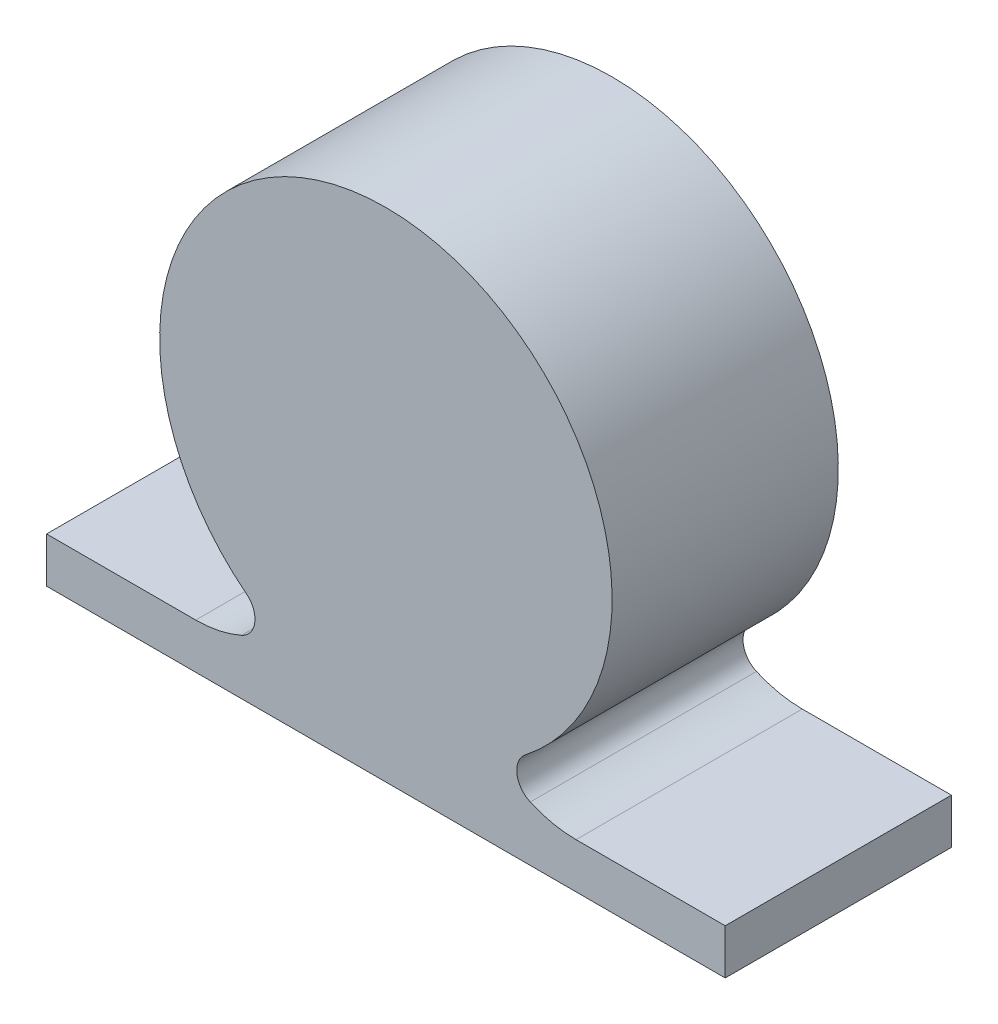
ISO-10303-21;
HEADER;
FILE_DESCRIPTION(('STEP AP214'),'2;1');
FILE_NAME('part.step','',(''),(''),'','','');
FILE_SCHEMA(('AUTOMOTIVE_DESIGN { 1 0 10303 214 1 1 1 1 }'));
ENDSEC;
DATA;
#1=APPLICATION_CONTEXT('core data for automotive mechanical design processes');
#2=APPLICATION_PROTOCOL_DEFINITION('international standard','automotive_design',2000,#1);
#3=PRODUCT_CONTEXT('',#1,'mechanical');
#4=PRODUCT('Part','Part','',(#3));
#5=PRODUCT_RELATED_PRODUCT_CATEGORY('part','',(#4));
#6=PRODUCT_DEFINITION_FORMATION('','',#4);
#7=PRODUCT_DEFINITION_CONTEXT('part definition',#1,'design');
#8=PRODUCT_DEFINITION('design','',#6,#7);
#9=PRODUCT_DEFINITION_SHAPE('','',#8);
#10=(LENGTH_UNIT() NAMED_UNIT(*) SI_UNIT(.MILLI.,.METRE.));
#11=(NAMED_UNIT(*) PLANE_ANGLE_UNIT() SI_UNIT($,.RADIAN.));
#12=(NAMED_UNIT(*) SI_UNIT($,.STERADIAN.) SOLID_ANGLE_UNIT());
#13=UNCERTAINTY_MEASURE_WITH_UNIT(LENGTH_MEASURE(1.E-05),#10,'distance_accuracy_value','');
#14=(GEOMETRIC_REPRESENTATION_CONTEXT(3) GLOBAL_UNCERTAINTY_ASSIGNED_CONTEXT((#13)) GLOBAL_UNIT_ASSIGNED_CONTEXT((#10,
#11,#12)) REPRESENTATION_CONTEXT('',''));
#15=CARTESIAN_POINT('',(0.,0.,0.));
#16=DIRECTION('',(0.,0.,1.));
#17=DIRECTION('',(1.,0.,0.));
#18=AXIS2_PLACEMENT_3D('',#15,#16,#17);
#19=CARTESIAN_POINT('',(0.,0.,5.08));
#20=DIRECTION('',(0.,0.,-1.));
#21=DIRECTION('',(-1.,0.,0.));
#22=AXIS2_PLACEMENT_3D('',#19,#20,#21);
#23=CYLINDRICAL_SURFACE('',#22,5.08);
#24=CARTESIAN_POINT('',(0.,0.,0.));
#25=DIRECTION('',(0.,0.,1.));
#26=DIRECTION('',(1.,0.,0.));
#27=AXIS2_PLACEMENT_3D('',#24,#25,#26);
#28=CIRCLE('',#27,5.08);
#29=CARTESIAN_POINT('',(3.1339820043525,-3.99806913351866,0.));
#30=VERTEX_POINT('',#29);
#31=CARTESIAN_POINT('',(-3.1339820043525,-3.99806913351867,0.));
#32=VERTEX_POINT('',#31);
#33=EDGE_CURVE('E149',#30,#32,#28,.T.);
#34=ORIENTED_EDGE('',*,*,#33,.T.);
#35=DIRECTION('',(0.,0.,-1.));
#36=VECTOR('',#35,1.);
#37=CARTESIAN_POINT('',(-3.1339820043525,-3.99806913351867,5.08));
#38=LINE('',#37,#36);
#39=CARTESIAN_POINT('',(-3.1339820043525,-3.99806913351867,5.08));
#40=VERTEX_POINT('',#39);
#41=EDGE_CURVE('E185',#32,#40,#38,.F.);
#42=ORIENTED_EDGE('',*,*,#41,.T.);
#43=CARTESIAN_POINT('',(0.,0.,5.08));
#44=DIRECTION('',(0.,0.,1.));
#45=DIRECTION('',(1.,0.,0.));
#46=AXIS2_PLACEMENT_3D('',#43,#44,#45);
#47=CIRCLE('',#46,5.08);
#48=CARTESIAN_POINT('',(3.1339820043525,-3.99806913351866,5.08));
#49=VERTEX_POINT('',#48);
#50=EDGE_CURVE('E123',#49,#40,#47,.T.);
#51=ORIENTED_EDGE('',*,*,#50,.F.);
#52=DIRECTION('',(0.,0.,-1.));
#53=VECTOR('',#52,1.);
#54=CARTESIAN_POINT('',(3.1339820043525,-3.99806913351866,5.08));
#55=LINE('',#54,#53);
#56=EDGE_CURVE('E182',#49,#30,#55,.T.);
#57=ORIENTED_EDGE('',*,*,#56,.T.);
#58=EDGE_LOOP('',(#34,#42,#51,#57));
#59=FACE_BOUND('',#58,.T.);
#60=ADVANCED_FACE('F36',(#59),#23,.T.);
#61=CARTESIAN_POINT('',(0.,-5.08,5.08));
#62=DIRECTION('',(0.,-1.,0.));
#63=DIRECTION('',(1.,0.,0.));
#64=AXIS2_PLACEMENT_3D('',#61,#62,#63);
#65=PLANE('',#64);
#66=DIRECTION('',(-1.,0.,0.));
#67=VECTOR('',#66,1.);
#68=CARTESIAN_POINT('',(0.,-5.08,5.08));
#69=LINE('',#68,#67);
#70=CARTESIAN_POINT('',(-4.27037509812836,-5.08,5.08));
#71=VERTEX_POINT('',#70);
#72=CARTESIAN_POINT('',(-7.62,-5.08,5.08));
#73=VERTEX_POINT('',#72);
#74=EDGE_CURVE('E111',#71,#73,#69,.T.);
#75=ORIENTED_EDGE('',*,*,#74,.F.);
#76=DIRECTION('',(0.,0.,-1.));
#77=VECTOR('',#76,1.);
#78=CARTESIAN_POINT('',(-4.27037509812836,-5.08,5.08));
#79=LINE('',#78,#77);
#80=CARTESIAN_POINT('',(-4.27037509812836,-5.08,0.));
#81=VERTEX_POINT('',#80);
#82=EDGE_CURVE('E133',#71,#81,#79,.T.);
#83=ORIENTED_EDGE('',*,*,#82,.T.);
#84=DIRECTION('',(-1.,0.,0.));
#85=VECTOR('',#84,1.);
#86=CARTESIAN_POINT('',(0.,-5.08,0.));
#87=LINE('',#86,#85);
#88=CARTESIAN_POINT('',(-7.62,-5.08,0.));
#89=VERTEX_POINT('',#88);
#90=EDGE_CURVE('E129',#81,#89,#87,.T.);
#91=ORIENTED_EDGE('',*,*,#90,.T.);
#92=DIRECTION('',(0.,0.,-1.));
#93=VECTOR('',#92,1.);
#94=CARTESIAN_POINT('',(-7.62,-5.08,5.08));
#95=LINE('',#94,#93);
#96=EDGE_CURVE('E126',#73,#89,#95,.T.);
#97=ORIENTED_EDGE('',*,*,#96,.F.);
#98=EDGE_LOOP('',(#75,#83,#91,#97));
#99=FACE_BOUND('',#98,.T.);
#100=ADVANCED_FACE('F127',(#99),#65,.F.);
#101=CARTESIAN_POINT('',(-7.62000000000002,0.,5.08));
#102=DIRECTION('',(1.,0.,0.));
#103=DIRECTION('',(0.,1.,0.));
#104=AXIS2_PLACEMENT_3D('',#101,#102,#103);
#105=PLANE('',#104);
#106=DIRECTION('',(0.,-1.,0.));
#107=VECTOR('',#106,1.);
#108=CARTESIAN_POINT('',(-7.62000000000002,0.,0.));
#109=LINE('',#108,#107);
#110=CARTESIAN_POINT('',(-7.62,-6.096,0.));
#111=VERTEX_POINT('',#110);
#112=EDGE_CURVE('E153',#89,#111,#109,.T.);
#113=ORIENTED_EDGE('',*,*,#112,.T.);
#114=DIRECTION('',(0.,0.,-1.));
#115=VECTOR('',#114,1.);
#116=CARTESIAN_POINT('',(-7.62,-6.096,5.08));
#117=LINE('',#116,#115);
#118=CARTESIAN_POINT('',(-7.62,-6.096,5.08));
#119=VERTEX_POINT('',#118);
#120=EDGE_CURVE('E134',#119,#111,#117,.T.);
#121=ORIENTED_EDGE('',*,*,#120,.F.);
#122=DIRECTION('',(0.,-1.,0.));
#123=VECTOR('',#122,1.);
#124=CARTESIAN_POINT('',(-7.62000000000002,0.,5.08));
#125=LINE('',#124,#123);
#126=EDGE_CURVE('E116',#73,#119,#125,.T.);
#127=ORIENTED_EDGE('',*,*,#126,.F.);
#128=ORIENTED_EDGE('',*,*,#96,.T.);
#129=EDGE_LOOP('',(#113,#121,#127,#128));
#130=FACE_BOUND('',#129,.T.);
#131=ADVANCED_FACE('F136',(#130),#105,.F.);
#132=CARTESIAN_POINT('',(0.,-6.096,5.08));
#133=DIRECTION('',(0.,-1.,0.));
#134=DIRECTION('',(0.,0.,-1.));
#135=AXIS2_PLACEMENT_3D('',#132,#133,#134);
#136=PLANE('',#135);
#137=DIRECTION('',(-1.,0.,0.));
#138=VECTOR('',#137,1.);
#139=CARTESIAN_POINT('',(0.,-6.096,0.));
#140=LINE('',#139,#138);
#141=CARTESIAN_POINT('',(7.62,-6.096,0.));
#142=VERTEX_POINT('',#141);
#143=EDGE_CURVE('E155',#142,#111,#140,.T.);
#144=ORIENTED_EDGE('',*,*,#143,.F.);
#145=DIRECTION('',(0.,0.,-1.));
#146=VECTOR('',#145,1.);
#147=CARTESIAN_POINT('',(7.62,-6.096,5.08));
#148=LINE('',#147,#146);
#149=CARTESIAN_POINT('',(7.62,-6.096,5.08));
#150=VERTEX_POINT('',#149);
#151=EDGE_CURVE('E165',#150,#142,#148,.T.);
#152=ORIENTED_EDGE('',*,*,#151,.F.);
#153=DIRECTION('',(-1.,0.,0.));
#154=VECTOR('',#153,1.);
#155=CARTESIAN_POINT('',(0.,-6.096,5.08));
#156=LINE('',#155,#154);
#157=EDGE_CURVE('E138',#150,#119,#156,.T.);
#158=ORIENTED_EDGE('',*,*,#157,.T.);
#159=ORIENTED_EDGE('',*,*,#120,.T.);
#160=EDGE_LOOP('',(#144,#152,#158,#159));
#161=FACE_BOUND('',#160,.T.);
#162=ADVANCED_FACE('F218',(#161),#136,.T.);
#163=CARTESIAN_POINT('',(7.61999999999999,0.,5.08));
#164=DIRECTION('',(1.,0.,0.));
#165=DIRECTION('',(0.,1.,0.));
#166=AXIS2_PLACEMENT_3D('',#163,#164,#165);
#167=PLANE('',#166);
#168=DIRECTION('',(0.,-1.,0.));
#169=VECTOR('',#168,1.);
#170=CARTESIAN_POINT('',(7.61999999999999,0.,0.));
#171=LINE('',#170,#169);
#172=CARTESIAN_POINT('',(7.62,-5.08,0.));
#173=VERTEX_POINT('',#172);
#174=EDGE_CURVE('E158',#173,#142,#171,.T.);
#175=ORIENTED_EDGE('',*,*,#174,.F.);
#176=DIRECTION('',(0.,0.,-1.));
#177=VECTOR('',#176,1.);
#178=CARTESIAN_POINT('',(7.62,-5.08,5.08));
#179=LINE('',#178,#177);
#180=CARTESIAN_POINT('',(7.62,-5.08,5.08));
#181=VERTEX_POINT('',#180);
#182=EDGE_CURVE('E148',#181,#173,#179,.T.);
#183=ORIENTED_EDGE('',*,*,#182,.F.);
#184=DIRECTION('',(0.,-1.,0.));
#185=VECTOR('',#184,1.);
#186=CARTESIAN_POINT('',(7.61999999999999,0.,5.08));
#187=LINE('',#186,#185);
#188=EDGE_CURVE('E140',#181,#150,#187,.T.);
#189=ORIENTED_EDGE('',*,*,#188,.T.);
#190=ORIENTED_EDGE('',*,*,#151,.T.);
#191=EDGE_LOOP('',(#175,#183,#189,#190));
#192=FACE_BOUND('',#191,.T.);
#193=ADVANCED_FACE('F216',(#192),#167,.T.);
#194=CARTESIAN_POINT('',(0.,-5.08,5.08));
#195=DIRECTION('',(0.,1.,0.));
#196=DIRECTION('',(0.,0.,1.));
#197=AXIS2_PLACEMENT_3D('',#194,#195,#196);
#198=PLANE('',#197);
#199=DIRECTION('',(1.,0.,0.));
#200=VECTOR('',#199,1.);
#201=CARTESIAN_POINT('',(0.,-5.08,0.));
#202=LINE('',#201,#200);
#203=CARTESIAN_POINT('',(4.27037509812836,-5.08,0.));
#204=VERTEX_POINT('',#203);
#205=EDGE_CURVE('E161',#204,#173,#202,.T.);
#206=ORIENTED_EDGE('',*,*,#205,.F.);
#207=DIRECTION('',(0.,0.,1.));
#208=VECTOR('',#207,1.);
#209=CARTESIAN_POINT('',(4.27037509812836,-5.08,5.08));
#210=LINE('',#209,#208);
#211=CARTESIAN_POINT('',(4.27037509812836,-5.08,5.08));
#212=VERTEX_POINT('',#211);
#213=EDGE_CURVE('E169',#204,#212,#210,.T.);
#214=ORIENTED_EDGE('',*,*,#213,.T.);
#215=DIRECTION('',(1.,0.,0.));
#216=VECTOR('',#215,1.);
#217=CARTESIAN_POINT('',(0.,-5.08,5.08));
#218=LINE('',#217,#216);
#219=EDGE_CURVE('E146',#212,#181,#218,.T.);
#220=ORIENTED_EDGE('',*,*,#219,.T.);
#221=ORIENTED_EDGE('',*,*,#182,.T.);
#222=EDGE_LOOP('',(#206,#214,#220,#221));
#223=FACE_BOUND('',#222,.T.);
#224=ADVANCED_FACE('F211',(#223),#198,.T.);
#225=CARTESIAN_POINT('',(0.,0.,5.08));
#226=DIRECTION('',(0.,0.,1.));
#227=DIRECTION('',(1.,0.,0.));
#228=AXIS2_PLACEMENT_3D('',#225,#226,#227);
#229=PLANE('',#228);
#230=CARTESIAN_POINT('',(4.27037509812836,-2.54,5.08));
#231=DIRECTION('',(0.,0.,1.));
#232=DIRECTION('',(1.,0.,0.));
#233=AXIS2_PLACEMENT_3D('',#230,#231,#232);
#234=CIRCLE('',#233,2.54);
#235=CARTESIAN_POINT('',(3.2416314814526,-4.86234505858816,5.08));
#236=VERTEX_POINT('',#235);
#237=EDGE_CURVE('E177',#212,#236,#234,.F.);
#238=ORIENTED_EDGE('',*,*,#237,.T.);
#239=CARTESIAN_POINT('',(3.44738020478775,-4.39787604687053,5.08));
#240=DIRECTION('',(0.,0.,1.));
#241=DIRECTION('',(1.,0.,0.));
#242=AXIS2_PLACEMENT_3D('',#239,#240,#241);
#243=CIRCLE('',#242,0.508);
#244=EDGE_CURVE('E11',#236,#49,#243,.F.);
#245=ORIENTED_EDGE('',*,*,#244,.T.);
#246=ORIENTED_EDGE('',*,*,#50,.T.);
#247=CARTESIAN_POINT('',(-3.44738020478775,-4.39787604687053,5.08));
#248=DIRECTION('',(0.,0.,1.));
#249=DIRECTION('',(1.,0.,0.));
#250=AXIS2_PLACEMENT_3D('',#247,#248,#249);
#251=CIRCLE('',#250,0.508);
#252=CARTESIAN_POINT('',(-3.2416314814526,-4.86234505858817,5.08));
#253=VERTEX_POINT('',#252);
#254=EDGE_CURVE('E190',#40,#253,#251,.F.);
#255=ORIENTED_EDGE('',*,*,#254,.T.);
#256=CARTESIAN_POINT('',(-4.27037509812836,-2.54,5.08));
#257=DIRECTION('',(0.,0.,1.));
#258=DIRECTION('',(1.,0.,0.));
#259=AXIS2_PLACEMENT_3D('',#256,#257,#258);
#260=CIRCLE('',#259,2.54);
#261=EDGE_CURVE('E119',#253,#71,#260,.F.);
#262=ORIENTED_EDGE('',*,*,#261,.T.);
#263=ORIENTED_EDGE('',*,*,#74,.T.);
#264=ORIENTED_EDGE('',*,*,#126,.T.);
#265=ORIENTED_EDGE('',*,*,#157,.F.);
#266=ORIENTED_EDGE('',*,*,#188,.F.);
#267=ORIENTED_EDGE('',*,*,#219,.F.);
#268=EDGE_LOOP('',(#238,#245,#246,#255,#262,#263,#264,#265,#266,#267));
#269=FACE_BOUND('',#268,.T.);
#270=ADVANCED_FACE('F113',(#269),#229,.T.);
#271=CARTESIAN_POINT('',(0.,0.,0.));
#272=DIRECTION('',(0.,0.,1.));
#273=DIRECTION('',(1.,0.,0.));
#274=AXIS2_PLACEMENT_3D('',#271,#272,#273);
#275=PLANE('',#274);
#276=ORIENTED_EDGE('',*,*,#33,.F.);
#277=CARTESIAN_POINT('',(3.44738020478775,-4.39787604687053,0.));
#278=DIRECTION('',(0.,0.,1.));
#279=DIRECTION('',(1.,0.,0.));
#280=AXIS2_PLACEMENT_3D('',#277,#278,#279);
#281=CIRCLE('',#280,0.508);
#282=CARTESIAN_POINT('',(3.2416314814526,-4.86234505858816,0.));
#283=VERTEX_POINT('',#282);
#284=EDGE_CURVE('E44',#30,#283,#281,.T.);
#285=ORIENTED_EDGE('',*,*,#284,.T.);
#286=CARTESIAN_POINT('',(4.27037509812836,-2.54,0.));
#287=DIRECTION('',(0.,0.,1.));
#288=DIRECTION('',(1.,0.,0.));
#289=AXIS2_PLACEMENT_3D('',#286,#287,#288);
#290=CIRCLE('',#289,2.54);
#291=EDGE_CURVE('E175',#283,#204,#290,.T.);
#292=ORIENTED_EDGE('',*,*,#291,.T.);
#293=ORIENTED_EDGE('',*,*,#205,.T.);
#294=ORIENTED_EDGE('',*,*,#174,.T.);
#295=ORIENTED_EDGE('',*,*,#143,.T.);
#296=ORIENTED_EDGE('',*,*,#112,.F.);
#297=ORIENTED_EDGE('',*,*,#90,.F.);
#298=CARTESIAN_POINT('',(-4.27037509812836,-2.54,0.));
#299=DIRECTION('',(0.,0.,1.));
#300=DIRECTION('',(1.,0.,0.));
#301=AXIS2_PLACEMENT_3D('',#298,#299,#300);
#302=CIRCLE('',#301,2.54);
#303=CARTESIAN_POINT('',(-3.2416314814526,-4.86234505858817,0.));
#304=VERTEX_POINT('',#303);
#305=EDGE_CURVE('E171',#81,#304,#302,.T.);
#306=ORIENTED_EDGE('',*,*,#305,.T.);
#307=CARTESIAN_POINT('',(-3.44738020478775,-4.39787604687053,0.));
#308=DIRECTION('',(0.,0.,1.));
#309=DIRECTION('',(1.,0.,0.));
#310=AXIS2_PLACEMENT_3D('',#307,#308,#309);
#311=CIRCLE('',#310,0.508);
#312=EDGE_CURVE('E188',#304,#32,#311,.T.);
#313=ORIENTED_EDGE('',*,*,#312,.T.);
#314=EDGE_LOOP('',(#276,#285,#292,#293,#294,#295,#296,#297,#306,#313));
#315=FACE_BOUND('',#314,.T.);
#316=ADVANCED_FACE('F200',(#315),#275,.F.);
#317=CARTESIAN_POINT('',(-4.27037509812836,-2.54,5.08));
#318=DIRECTION('',(0.,0.,-1.));
#319=DIRECTION('',(-1.,0.,0.));
#320=AXIS2_PLACEMENT_3D('',#317,#318,#319);
#321=CYLINDRICAL_SURFACE('',#320,2.54);
#322=ORIENTED_EDGE('',*,*,#261,.F.);
#323=DIRECTION('',(0.,0.,-1.));
#324=VECTOR('',#323,1.);
#325=CARTESIAN_POINT('',(-3.2416314814526,-4.86234505858817,5.08));
#326=LINE('',#325,#324);
#327=EDGE_CURVE('E179',#253,#304,#326,.T.);
#328=ORIENTED_EDGE('',*,*,#327,.T.);
#329=ORIENTED_EDGE('',*,*,#305,.F.);
#330=ORIENTED_EDGE('',*,*,#82,.F.);
#331=EDGE_LOOP('',(#322,#328,#329,#330));
#332=FACE_BOUND('',#331,.T.);
#333=ADVANCED_FACE('F198',(#332),#321,.F.);
#334=CARTESIAN_POINT('',(4.27037509812836,-2.54,5.08));
#335=DIRECTION('',(0.,0.,-1.));
#336=DIRECTION('',(-1.,0.,0.));
#337=AXIS2_PLACEMENT_3D('',#334,#335,#336);
#338=CYLINDRICAL_SURFACE('',#337,2.54);
#339=ORIENTED_EDGE('',*,*,#291,.F.);
#340=DIRECTION('',(0.,0.,-1.));
#341=VECTOR('',#340,1.);
#342=CARTESIAN_POINT('',(3.2416314814526,-4.86234505858816,5.08));
#343=LINE('',#342,#341);
#344=EDGE_CURVE('E57',#283,#236,#343,.F.);
#345=ORIENTED_EDGE('',*,*,#344,.T.);
#346=ORIENTED_EDGE('',*,*,#237,.F.);
#347=ORIENTED_EDGE('',*,*,#213,.F.);
#348=EDGE_LOOP('',(#339,#345,#346,#347));
#349=FACE_BOUND('',#348,.T.);
#350=ADVANCED_FACE('F208',(#349),#338,.F.);
#351=CARTESIAN_POINT('',(-3.44738020478775,-4.39787604687053,5.08));
#352=DIRECTION('',(0.,0.,-1.));
#353=DIRECTION('',(-1.,0.,0.));
#354=AXIS2_PLACEMENT_3D('',#351,#352,#353);
#355=CYLINDRICAL_SURFACE('',#354,0.508);
#356=ORIENTED_EDGE('',*,*,#254,.F.);
#357=ORIENTED_EDGE('',*,*,#41,.F.);
#358=ORIENTED_EDGE('',*,*,#312,.F.);
#359=ORIENTED_EDGE('',*,*,#327,.F.);
#360=EDGE_LOOP('',(#356,#357,#358,#359));
#361=FACE_BOUND('',#360,.T.);
#362=ADVANCED_FACE('F199',(#361),#355,.F.);
#363=CARTESIAN_POINT('',(3.44738020478775,-4.39787604687053,5.08));
#364=DIRECTION('',(0.,0.,-1.));
#365=DIRECTION('',(-1.,0.,0.));
#366=AXIS2_PLACEMENT_3D('',#363,#364,#365);
#367=CYLINDRICAL_SURFACE('',#366,0.508);
#368=ORIENTED_EDGE('',*,*,#244,.F.);
#369=ORIENTED_EDGE('',*,*,#344,.F.);
#370=ORIENTED_EDGE('',*,*,#284,.F.);
#371=ORIENTED_EDGE('',*,*,#56,.F.);
#372=EDGE_LOOP('',(#368,#369,#370,#371));
#373=FACE_BOUND('',#372,.T.);
#374=ADVANCED_FACE('F38',(#373),#367,.F.);
#375=CLOSED_SHELL('',(#60,#100,#131,#162,#193,#224,#270,#316,#333,#350,#362,#374));
#376=MANIFOLD_SOLID_BREP('B2',#375);
#377=ADVANCED_BREP_SHAPE_REPRESENTATION('',(#18,#376),#14);
#378=SHAPE_DEFINITION_REPRESENTATION(#9,#377);
ENDSEC;
END-ISO-10303-21;
